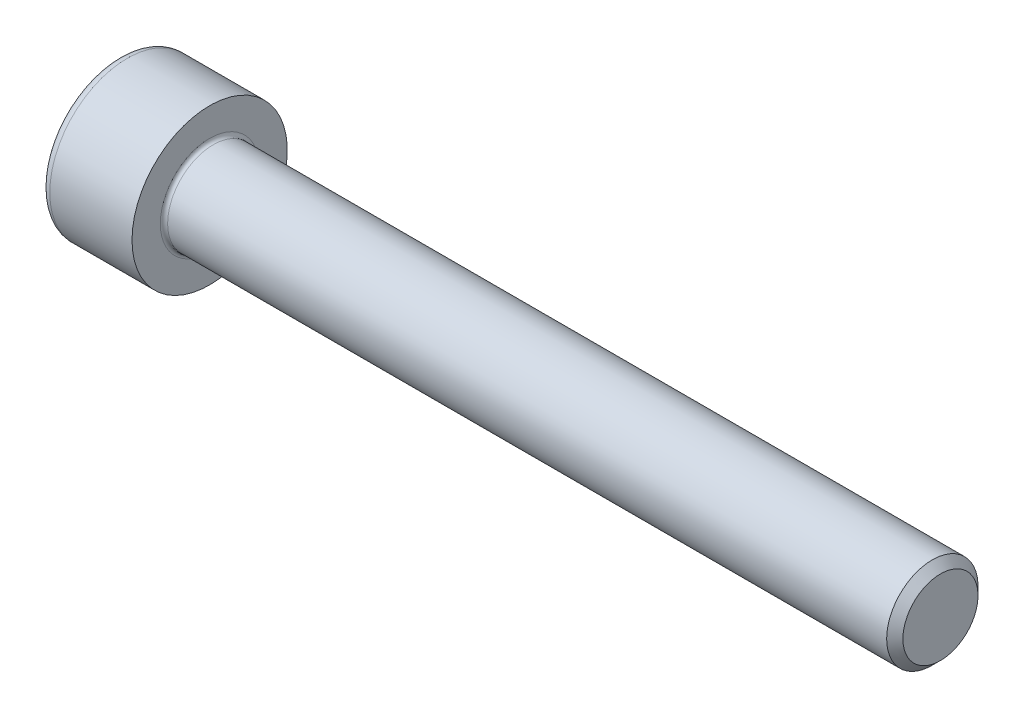
ISO-10303-21;
HEADER;
FILE_DESCRIPTION(('STEP AP214'),'2;1');
FILE_NAME('part.step','',(''),(''),'','','');
FILE_SCHEMA(('AUTOMOTIVE_DESIGN { 1 0 10303 214 1 1 1 1 }'));
ENDSEC;
DATA;
#1=APPLICATION_CONTEXT('core data for automotive mechanical design processes');
#2=APPLICATION_PROTOCOL_DEFINITION('international standard','automotive_design',2000,#1);
#3=PRODUCT_CONTEXT('',#1,'mechanical');
#4=PRODUCT('Part','Part','',(#3));
#5=PRODUCT_RELATED_PRODUCT_CATEGORY('part','',(#4));
#6=PRODUCT_DEFINITION_FORMATION('','',#4);
#7=PRODUCT_DEFINITION_CONTEXT('part definition',#1,'design');
#8=PRODUCT_DEFINITION('design','',#6,#7);
#9=PRODUCT_DEFINITION_SHAPE('','',#8);
#10=(LENGTH_UNIT() NAMED_UNIT(*) SI_UNIT(.MILLI.,.METRE.));
#11=(NAMED_UNIT(*) PLANE_ANGLE_UNIT() SI_UNIT($,.RADIAN.));
#12=(NAMED_UNIT(*) SI_UNIT($,.STERADIAN.) SOLID_ANGLE_UNIT());
#13=UNCERTAINTY_MEASURE_WITH_UNIT(LENGTH_MEASURE(1.E-05),#10,'distance_accuracy_value','');
#14=(GEOMETRIC_REPRESENTATION_CONTEXT(3) GLOBAL_UNCERTAINTY_ASSIGNED_CONTEXT((#13)) GLOBAL_UNIT_ASSIGNED_CONTEXT((#10,
#11,#12)) REPRESENTATION_CONTEXT('',''));
#15=CARTESIAN_POINT('',(0.,0.,0.));
#16=DIRECTION('',(0.,0.,1.));
#17=DIRECTION('',(1.,0.,0.));
#18=AXIS2_PLACEMENT_3D('',#15,#16,#17);
#19=CARTESIAN_POINT('',(2.5,3.48142212321344,-2.00999999999996));
#20=DIRECTION('',(1.,0.,0.));
#21=DIRECTION('',(0.,0.,-1.));
#22=AXIS2_PLACEMENT_3D('',#19,#20,#21);
#23=PLANE('',#22);
#24=DIRECTION('',(0.,1.,0.));
#25=VECTOR('',#24,1.);
#26=CARTESIAN_POINT('',(2.5,3.48142212321344,2.00999999999996));
#27=LINE('',#26,#25);
#28=CARTESIAN_POINT('',(2.50000000001364,0.,2.00999999998183));
#29=VERTEX_POINT('',#28);
#30=CARTESIAN_POINT('',(2.5,-1.16047404107116,2.00999999999996));
#31=VERTEX_POINT('',#30);
#32=EDGE_CURVE('E103',#29,#31,#27,.F.);
#33=ORIENTED_EDGE('',*,*,#32,.F.);
#34=CARTESIAN_POINT('',(2.50000000002175,0.,0.));
#35=DIRECTION('',(-1.,0.,0.));
#36=DIRECTION('',(0.,0.,1.));
#37=AXIS2_PLACEMENT_3D('',#34,#35,#36);
#38=CIRCLE('',#37,2.0099999999843);
#39=CARTESIAN_POINT('',(2.50000000001087,-1.74071106159992,1.0049999999961));
#40=VERTEX_POINT('',#39);
#41=EDGE_CURVE('E105',#29,#40,#38,.F.);
#42=ORIENTED_EDGE('',*,*,#41,.T.);
#43=DIRECTION('',(0.,-0.500000000000027,-0.866025403784423));
#44=VECTOR('',#43,1.);
#45=CARTESIAN_POINT('',(2.5,-1.16047404107116,2.00999999999996));
#46=LINE('',#45,#44);
#47=EDGE_CURVE('E108',#31,#40,#46,.T.);
#48=ORIENTED_EDGE('',*,*,#47,.F.);
#49=EDGE_LOOP('',(#33,#42,#48));
#50=FACE_BOUND('',#49,.T.);
#51=ADVANCED_FACE('F18',(#50),#23,.F.);
#52=CARTESIAN_POINT('',(2.5,3.48142212321344,-2.00999999999996));
#53=DIRECTION('',(1.,0.,0.));
#54=DIRECTION('',(0.,0.,-1.));
#55=AXIS2_PLACEMENT_3D('',#52,#53,#54);
#56=PLANE('',#55);
#57=DIRECTION('',(0.,-0.499999999999985,-0.866025403784447));
#58=VECTOR('',#57,1.);
#59=CARTESIAN_POINT('',(2.5,-1.74071106160673,1.00500000000003));
#60=LINE('',#59,#58);
#61=CARTESIAN_POINT('',(2.5,-2.3209480821423,0.));
#62=VERTEX_POINT('',#61);
#63=EDGE_CURVE('E177',#40,#62,#60,.T.);
#64=ORIENTED_EDGE('',*,*,#63,.F.);
#65=CARTESIAN_POINT('',(2.50000000002175,0.,0.));
#66=DIRECTION('',(-1.,0.,0.));
#67=DIRECTION('',(0.,0.,1.));
#68=AXIS2_PLACEMENT_3D('',#65,#66,#67);
#69=CIRCLE('',#68,2.0099999999843);
#70=CARTESIAN_POINT('',(2.50000000001087,-1.74071106159992,-1.0049999999961));
#71=VERTEX_POINT('',#70);
#72=EDGE_CURVE('E123',#40,#71,#69,.F.);
#73=ORIENTED_EDGE('',*,*,#72,.T.);
#74=DIRECTION('',(0.,0.499999999999985,-0.866025403784447));
#75=VECTOR('',#74,1.);
#76=CARTESIAN_POINT('',(2.5,-2.3209480821423,0.));
#77=LINE('',#76,#75);
#78=EDGE_CURVE('E173',#62,#71,#77,.T.);
#79=ORIENTED_EDGE('',*,*,#78,.F.);
#80=EDGE_LOOP('',(#64,#73,#79));
#81=FACE_BOUND('',#80,.T.);
#82=ADVANCED_FACE('F367',(#81),#56,.F.);
#83=CARTESIAN_POINT('',(2.5,3.48142212321344,-2.00999999999996));
#84=DIRECTION('',(1.,0.,0.));
#85=DIRECTION('',(0.,0.,-1.));
#86=AXIS2_PLACEMENT_3D('',#83,#84,#85);
#87=PLANE('',#86);
#88=DIRECTION('',(0.,0.500000000000027,-0.866025403784423));
#89=VECTOR('',#88,1.);
#90=CARTESIAN_POINT('',(2.5,-1.74071106160673,-1.00500000000003));
#91=LINE('',#90,#89);
#92=CARTESIAN_POINT('',(2.5,-1.16047404107116,-2.00999999999996));
#93=VERTEX_POINT('',#92);
#94=EDGE_CURVE('E169',#71,#93,#91,.T.);
#95=ORIENTED_EDGE('',*,*,#94,.F.);
#96=CARTESIAN_POINT('',(2.50000000002175,0.,0.));
#97=DIRECTION('',(-1.,0.,0.));
#98=DIRECTION('',(0.,0.,1.));
#99=AXIS2_PLACEMENT_3D('',#96,#97,#98);
#100=CIRCLE('',#99,2.0099999999843);
#101=CARTESIAN_POINT('',(2.50000000001364,0.,-2.00999999998183));
#102=VERTEX_POINT('',#101);
#103=EDGE_CURVE('E223',#71,#102,#100,.F.);
#104=ORIENTED_EDGE('',*,*,#103,.T.);
#105=DIRECTION('',(0.,1.,0.));
#106=VECTOR('',#105,1.);
#107=CARTESIAN_POINT('',(2.5,3.48142212321344,-2.00999999999996));
#108=LINE('',#107,#106);
#109=EDGE_CURVE('E165',#93,#102,#108,.T.);
#110=ORIENTED_EDGE('',*,*,#109,.F.);
#111=EDGE_LOOP('',(#95,#104,#110));
#112=FACE_BOUND('',#111,.T.);
#113=ADVANCED_FACE('F361',(#112),#87,.F.);
#114=CARTESIAN_POINT('',(2.5,3.48142212321344,-2.00999999999996));
#115=DIRECTION('',(1.,0.,0.));
#116=DIRECTION('',(0.,0.,-1.));
#117=AXIS2_PLACEMENT_3D('',#114,#115,#116);
#118=PLANE('',#117);
#119=DIRECTION('',(0.,1.,0.));
#120=VECTOR('',#119,1.);
#121=CARTESIAN_POINT('',(2.5,3.48142212321344,-2.00999999999996));
#122=LINE('',#121,#120);
#123=CARTESIAN_POINT('',(2.5,1.16047404107114,-2.00999999999996));
#124=VERTEX_POINT('',#123);
#125=EDGE_CURVE('E161',#102,#124,#122,.T.);
#126=ORIENTED_EDGE('',*,*,#125,.F.);
#127=CARTESIAN_POINT('',(2.50000000002175,0.,0.));
#128=DIRECTION('',(-1.,0.,0.));
#129=DIRECTION('',(0.,0.,1.));
#130=AXIS2_PLACEMENT_3D('',#127,#128,#129);
#131=CIRCLE('',#130,2.0099999999843);
#132=CARTESIAN_POINT('',(2.50000000001087,1.74071106159991,-1.00499999999611));
#133=VERTEX_POINT('',#132);
#134=EDGE_CURVE('E220',#102,#133,#131,.F.);
#135=ORIENTED_EDGE('',*,*,#134,.T.);
#136=DIRECTION('',(0.,0.500000000000027,0.866025403784423));
#137=VECTOR('',#136,1.);
#138=CARTESIAN_POINT('',(2.5,1.16047404107114,-2.00999999999996));
#139=LINE('',#138,#137);
#140=EDGE_CURVE('E157',#124,#133,#139,.T.);
#141=ORIENTED_EDGE('',*,*,#140,.F.);
#142=EDGE_LOOP('',(#126,#135,#141));
#143=FACE_BOUND('',#142,.T.);
#144=ADVANCED_FACE('F353',(#143),#118,.F.);
#145=CARTESIAN_POINT('',(2.5,3.48142212321344,-2.00999999999996));
#146=DIRECTION('',(1.,0.,0.));
#147=DIRECTION('',(0.,0.,-1.));
#148=AXIS2_PLACEMENT_3D('',#145,#146,#147);
#149=PLANE('',#148);
#150=DIRECTION('',(0.,0.499999999999985,0.866025403784447));
#151=VECTOR('',#150,1.);
#152=CARTESIAN_POINT('',(2.5,1.74071106160671,-1.00500000000003));
#153=LINE('',#152,#151);
#154=CARTESIAN_POINT('',(2.5,2.32094808214228,0.));
#155=VERTEX_POINT('',#154);
#156=EDGE_CURVE('E153',#133,#155,#153,.T.);
#157=ORIENTED_EDGE('',*,*,#156,.F.);
#158=CARTESIAN_POINT('',(2.50000000002175,0.,0.));
#159=DIRECTION('',(-1.,0.,0.));
#160=DIRECTION('',(0.,0.,1.));
#161=AXIS2_PLACEMENT_3D('',#158,#159,#160);
#162=CIRCLE('',#161,2.0099999999843);
#163=CARTESIAN_POINT('',(2.50000000001087,1.74071106159991,1.00499999999611));
#164=VERTEX_POINT('',#163);
#165=EDGE_CURVE('E131',#133,#164,#162,.F.);
#166=ORIENTED_EDGE('',*,*,#165,.T.);
#167=DIRECTION('',(0.,-0.499999999999985,0.866025403784447));
#168=VECTOR('',#167,1.);
#169=CARTESIAN_POINT('',(2.5,2.32094808214228,0.));
#170=LINE('',#169,#168);
#171=EDGE_CURVE('E124',#155,#164,#170,.T.);
#172=ORIENTED_EDGE('',*,*,#171,.F.);
#173=EDGE_LOOP('',(#157,#166,#172));
#174=FACE_BOUND('',#173,.T.);
#175=ADVANCED_FACE('F349',(#174),#149,.F.);
#176=CARTESIAN_POINT('',(2.50000000005457,0.,0.));
#177=DIRECTION('',(-1.,0.,0.));
#178=DIRECTION('',(0.,0.,1.));
#179=AXIS2_PLACEMENT_3D('',#176,#177,#178);
#180=CONICAL_SURFACE('',#179,2.00999999992746,1.04719755117379);
#181=CARTESIAN_POINT('',(3.66047404111214,0.,-5.6843418860808E-11));
#182=VERTEX_POINT('',#181);
#183=VERTEX_LOOP('',#182);
#184=FACE_BOUND('',#183,.T.);
#185=ORIENTED_EDGE('',*,*,#41,.F.);
#186=CARTESIAN_POINT('',(2.50000000002175,0.,0.));
#187=DIRECTION('',(-1.,0.,0.));
#188=DIRECTION('',(0.,0.,1.));
#189=AXIS2_PLACEMENT_3D('',#186,#187,#188);
#190=CIRCLE('',#189,2.0099999999843);
#191=EDGE_CURVE('E119',#29,#164,#190,.T.);
#192=ORIENTED_EDGE('',*,*,#191,.T.);
#193=ORIENTED_EDGE('',*,*,#165,.F.);
#194=ORIENTED_EDGE('',*,*,#134,.F.);
#195=ORIENTED_EDGE('',*,*,#103,.F.);
#196=ORIENTED_EDGE('',*,*,#72,.F.);
#197=EDGE_LOOP('',(#185,#192,#193,#194,#195,#196));
#198=FACE_BOUND('',#197,.T.);
#199=ADVANCED_FACE('F117',(#184,#198),#180,.F.);
#200=CARTESIAN_POINT('',(2.5,3.48142212321344,-2.00999999999996));
#201=DIRECTION('',(1.,0.,0.));
#202=DIRECTION('',(0.,0.,-1.));
#203=AXIS2_PLACEMENT_3D('',#200,#201,#202);
#204=PLANE('',#203);
#205=DIRECTION('',(0.,0.499999999999999,-0.866025403784439));
#206=VECTOR('',#205,1.);
#207=CARTESIAN_POINT('',(2.5,2.32094808214228,0.));
#208=LINE('',#207,#206);
#209=CARTESIAN_POINT('',(2.5,1.16047404107115,2.00999999999996));
#210=VERTEX_POINT('',#209);
#211=EDGE_CURVE('E130',#164,#210,#208,.F.);
#212=ORIENTED_EDGE('',*,*,#211,.F.);
#213=ORIENTED_EDGE('',*,*,#191,.F.);
#214=DIRECTION('',(0.,-1.,0.));
#215=VECTOR('',#214,1.);
#216=CARTESIAN_POINT('',(2.5,-1.16047404107116,2.00999999999996));
#217=LINE('',#216,#215);
#218=EDGE_CURVE('E128',#29,#210,#217,.F.);
#219=ORIENTED_EDGE('',*,*,#218,.T.);
#220=EDGE_LOOP('',(#212,#213,#219));
#221=FACE_BOUND('',#220,.T.);
#222=ADVANCED_FACE('F127',(#221),#204,.F.);
#223=CARTESIAN_POINT('',(2.5,2.32094808214228,0.));
#224=DIRECTION('',(0.,-0.866025403784439,-0.499999999999999));
#225=DIRECTION('',(0.,0.499999999999999,-0.866025403784439));
#226=AXIS2_PLACEMENT_3D('',#223,#224,#225);
#227=PLANE('',#226);
#228=ORIENTED_EDGE('',*,*,#211,.T.);
#229=DIRECTION('',(1.,0.,0.));
#230=VECTOR('',#229,1.);
#231=CARTESIAN_POINT('',(2.5,1.16047404107114,2.00999999999995));
#232=LINE('',#231,#230);
#233=CARTESIAN_POINT('',(0.,1.16047404107115,2.00999999999996));
#234=VERTEX_POINT('',#233);
#235=EDGE_CURVE('E136',#210,#234,#232,.F.);
#236=ORIENTED_EDGE('',*,*,#235,.T.);
#237=DIRECTION('',(0.,-0.500000000000006,0.866025403784435));
#238=VECTOR('',#237,1.);
#239=CARTESIAN_POINT('',(0.,2.32094808214228,0.));
#240=LINE('',#239,#238);
#241=CARTESIAN_POINT('',(0.,2.32094808214228,0.));
#242=VERTEX_POINT('',#241);
#243=EDGE_CURVE('E196',#242,#234,#240,.T.);
#244=ORIENTED_EDGE('',*,*,#243,.F.);
#245=DIRECTION('',(1.,0.,0.));
#246=VECTOR('',#245,1.);
#247=CARTESIAN_POINT('',(2.5,2.32094808214228,0.));
#248=LINE('',#247,#246);
#249=EDGE_CURVE('E188',#242,#155,#248,.T.);
#250=ORIENTED_EDGE('',*,*,#249,.T.);
#251=ORIENTED_EDGE('',*,*,#171,.T.);
#252=EDGE_LOOP('',(#228,#236,#244,#250,#251));
#253=FACE_BOUND('',#252,.T.);
#254=ADVANCED_FACE('F342',(#253),#227,.T.);
#255=CARTESIAN_POINT('',(2.5,-1.16047404107116,2.00999999999996));
#256=DIRECTION('',(0.,0.,1.));
#257=DIRECTION('',(0.,-1.,0.));
#258=AXIS2_PLACEMENT_3D('',#255,#256,#257);
#259=PLANE('',#258);
#260=ORIENTED_EDGE('',*,*,#235,.F.);
#261=ORIENTED_EDGE('',*,*,#218,.F.);
#262=ORIENTED_EDGE('',*,*,#32,.T.);
#263=DIRECTION('',(1.,0.,0.));
#264=VECTOR('',#263,1.);
#265=CARTESIAN_POINT('',(2.5,-1.16047404107116,2.00999999999996));
#266=LINE('',#265,#264);
#267=CARTESIAN_POINT('',(0.,-1.16047404107116,2.00999999999996));
#268=VERTEX_POINT('',#267);
#269=EDGE_CURVE('E138',#268,#31,#266,.T.);
#270=ORIENTED_EDGE('',*,*,#269,.F.);
#271=DIRECTION('',(0.,1.,0.));
#272=VECTOR('',#271,1.);
#273=CARTESIAN_POINT('',(0.,0.,2.00999999999996));
#274=LINE('',#273,#272);
#275=EDGE_CURVE('E337',#234,#268,#274,.F.);
#276=ORIENTED_EDGE('',*,*,#275,.F.);
#277=EDGE_LOOP('',(#260,#261,#262,#270,#276));
#278=FACE_BOUND('',#277,.T.);
#279=ADVANCED_FACE('F134',(#278),#259,.F.);
#280=CARTESIAN_POINT('',(2.5,-1.16047404107116,2.00999999999996));
#281=DIRECTION('',(0.,0.866025403784438,-0.500000000000001));
#282=DIRECTION('',(0.,0.500000000000001,0.866025403784438));
#283=AXIS2_PLACEMENT_3D('',#280,#281,#282);
#284=PLANE('',#283);
#285=ORIENTED_EDGE('',*,*,#63,.T.);
#286=DIRECTION('',(1.,0.,0.));
#287=VECTOR('',#286,1.);
#288=CARTESIAN_POINT('',(2.5,-2.3209480821423,0.));
#289=LINE('',#288,#287);
#290=CARTESIAN_POINT('',(0.,-2.32094808214229,0.));
#291=VERTEX_POINT('',#290);
#292=EDGE_CURVE('E200',#291,#62,#289,.T.);
#293=ORIENTED_EDGE('',*,*,#292,.F.);
#294=DIRECTION('',(0.,-0.500000000000006,-0.866025403784435));
#295=VECTOR('',#294,1.);
#296=CARTESIAN_POINT('',(0.,-1.16047404107116,2.00999999999996));
#297=LINE('',#296,#295);
#298=EDGE_CURVE('E334',#268,#291,#297,.T.);
#299=ORIENTED_EDGE('',*,*,#298,.F.);
#300=ORIENTED_EDGE('',*,*,#269,.T.);
#301=ORIENTED_EDGE('',*,*,#47,.T.);
#302=EDGE_LOOP('',(#285,#293,#299,#300,#301));
#303=FACE_BOUND('',#302,.T.);
#304=ADVANCED_FACE('F369',(#303),#284,.T.);
#305=CARTESIAN_POINT('',(2.5,-2.3209480821423,0.));
#306=DIRECTION('',(0.,0.866025403784439,0.499999999999999));
#307=DIRECTION('',(0.,-0.499999999999999,0.866025403784439));
#308=AXIS2_PLACEMENT_3D('',#305,#306,#307);
#309=PLANE('',#308);
#310=ORIENTED_EDGE('',*,*,#94,.T.);
#311=DIRECTION('',(1.,0.,0.));
#312=VECTOR('',#311,1.);
#313=CARTESIAN_POINT('',(2.5,-1.16047404107116,-2.00999999999995));
#314=LINE('',#313,#312);
#315=CARTESIAN_POINT('',(0.,-1.16047404107116,-2.00999999999996));
#316=VERTEX_POINT('',#315);
#317=EDGE_CURVE('E192',#93,#316,#314,.F.);
#318=ORIENTED_EDGE('',*,*,#317,.T.);
#319=DIRECTION('',(0.,0.500000000000006,-0.866025403784435));
#320=VECTOR('',#319,1.);
#321=CARTESIAN_POINT('',(0.,-2.3209480821423,0.));
#322=LINE('',#321,#320);
#323=EDGE_CURVE('E329',#291,#316,#322,.T.);
#324=ORIENTED_EDGE('',*,*,#323,.F.);
#325=ORIENTED_EDGE('',*,*,#292,.T.);
#326=ORIENTED_EDGE('',*,*,#78,.T.);
#327=EDGE_LOOP('',(#310,#318,#324,#325,#326));
#328=FACE_BOUND('',#327,.T.);
#329=ADVANCED_FACE('F363',(#328),#309,.T.);
#330=CARTESIAN_POINT('',(2.5,1.16047404107114,-2.00999999999996));
#331=DIRECTION('',(0.,0.,-1.));
#332=DIRECTION('',(0.,1.,0.));
#333=AXIS2_PLACEMENT_3D('',#330,#331,#332);
#334=PLANE('',#333);
#335=ORIENTED_EDGE('',*,*,#317,.F.);
#336=ORIENTED_EDGE('',*,*,#109,.T.);
#337=ORIENTED_EDGE('',*,*,#125,.T.);
#338=DIRECTION('',(1.,0.,0.));
#339=VECTOR('',#338,1.);
#340=CARTESIAN_POINT('',(2.5,1.16047404107115,-2.00999999999996));
#341=LINE('',#340,#339);
#342=CARTESIAN_POINT('',(0.,1.16047404107114,-2.00999999999996));
#343=VERTEX_POINT('',#342);
#344=EDGE_CURVE('E191',#124,#343,#341,.F.);
#345=ORIENTED_EDGE('',*,*,#344,.T.);
#346=DIRECTION('',(0.,1.,0.));
#347=VECTOR('',#346,1.);
#348=CARTESIAN_POINT('',(0.,0.,-2.00999999999996));
#349=LINE('',#348,#347);
#350=EDGE_CURVE('E325',#316,#343,#349,.T.);
#351=ORIENTED_EDGE('',*,*,#350,.F.);
#352=EDGE_LOOP('',(#335,#336,#337,#345,#351));
#353=FACE_BOUND('',#352,.T.);
#354=ADVANCED_FACE('F356',(#353),#334,.F.);
#355=CARTESIAN_POINT('',(2.5,2.32094808214228,0.));
#356=DIRECTION('',(0.,0.866025403784438,-0.500000000000001));
#357=DIRECTION('',(0.,0.500000000000001,0.866025403784438));
#358=AXIS2_PLACEMENT_3D('',#355,#356,#357);
#359=PLANE('',#358);
#360=ORIENTED_EDGE('',*,*,#344,.F.);
#361=ORIENTED_EDGE('',*,*,#140,.T.);
#362=ORIENTED_EDGE('',*,*,#156,.T.);
#363=ORIENTED_EDGE('',*,*,#249,.F.);
#364=DIRECTION('',(0.,0.500000000000006,0.866025403784435));
#365=VECTOR('',#364,1.);
#366=CARTESIAN_POINT('',(0.,1.16047404107114,-2.00999999999996));
#367=LINE('',#366,#365);
#368=EDGE_CURVE('E323',#343,#242,#367,.T.);
#369=ORIENTED_EDGE('',*,*,#368,.F.);
#370=EDGE_LOOP('',(#360,#361,#362,#363,#369));
#371=FACE_BOUND('',#370,.T.);
#372=ADVANCED_FACE('F299',(#371),#359,.F.);
#373=CARTESIAN_POINT('',(0.,0.,0.));
#374=DIRECTION('',(-1.,0.,0.));
#375=DIRECTION('',(0.,0.,1.));
#376=AXIS2_PLACEMENT_3D('',#373,#374,#375);
#377=PLANE('',#376);
#378=CARTESIAN_POINT('',(0.,0.,0.));
#379=DIRECTION('',(1.,0.,0.));
#380=DIRECTION('',(0.,0.,-1.));
#381=AXIS2_PLACEMENT_3D('',#378,#379,#380);
#382=CIRCLE('',#381,3.75);
#383=CARTESIAN_POINT('',(0.,0.,-3.75));
#384=VERTEX_POINT('',#383);
#385=CARTESIAN_POINT('',(0.,0.,3.75));
#386=VERTEX_POINT('',#385);
#387=EDGE_CURVE('E320',#384,#386,#382,.T.);
#388=ORIENTED_EDGE('',*,*,#387,.F.);
#389=CARTESIAN_POINT('',(0.,0.,0.));
#390=DIRECTION('',(1.,0.,0.));
#391=DIRECTION('',(0.,0.,1.));
#392=AXIS2_PLACEMENT_3D('',#389,#390,#391);
#393=CIRCLE('',#392,3.75);
#394=EDGE_CURVE('E318',#386,#384,#393,.T.);
#395=ORIENTED_EDGE('',*,*,#394,.F.);
#396=EDGE_LOOP('',(#388,#395));
#397=FACE_BOUND('',#396,.T.);
#398=ORIENTED_EDGE('',*,*,#350,.T.);
#399=ORIENTED_EDGE('',*,*,#368,.T.);
#400=ORIENTED_EDGE('',*,*,#243,.T.);
#401=ORIENTED_EDGE('',*,*,#275,.T.);
#402=ORIENTED_EDGE('',*,*,#298,.T.);
#403=ORIENTED_EDGE('',*,*,#323,.T.);
#404=EDGE_LOOP('',(#398,#399,#400,#401,#402,#403));
#405=FACE_BOUND('',#404,.T.);
#406=ADVANCED_FACE('F293',(#397,#405),#377,.T.);
#407=CARTESIAN_POINT('',(0.5,0.,0.));
#408=DIRECTION('',(-1.,0.,0.));
#409=DIRECTION('',(0.,0.,1.));
#410=AXIS2_PLACEMENT_3D('',#407,#408,#409);
#411=TOROIDAL_SURFACE('',#410,3.75,0.5);
#412=CARTESIAN_POINT('',(0.5,0.,0.));
#413=DIRECTION('',(-1.,0.,0.));
#414=DIRECTION('',(0.,0.,1.));
#415=AXIS2_PLACEMENT_3D('',#412,#413,#414);
#416=CIRCLE('',#415,4.25);
#417=CARTESIAN_POINT('',(0.5,0.,4.25));
#418=VERTEX_POINT('',#417);
#419=EDGE_CURVE('E216',#418,#418,#416,.F.);
#420=ORIENTED_EDGE('',*,*,#419,.F.);
#421=EDGE_LOOP('',(#420));
#422=FACE_BOUND('',#421,.T.);
#423=ORIENTED_EDGE('',*,*,#394,.T.);
#424=ORIENTED_EDGE('',*,*,#387,.T.);
#425=EDGE_LOOP('',(#423,#424));
#426=FACE_BOUND('',#425,.T.);
#427=ADVANCED_FACE('F288',(#422,#426),#411,.T.);
#428=CARTESIAN_POINT('',(-31.75,0.,0.));
#429=DIRECTION('',(-1.,0.,0.));
#430=DIRECTION('',(0.,0.,1.));
#431=AXIS2_PLACEMENT_3D('',#428,#429,#430);
#432=CYLINDRICAL_SURFACE('',#431,4.25);
#433=CARTESIAN_POINT('',(5.,0.,0.));
#434=DIRECTION('',(-1.,0.,0.));
#435=DIRECTION('',(0.,0.,1.));
#436=AXIS2_PLACEMENT_3D('',#433,#434,#435);
#437=CIRCLE('',#436,4.25);
#438=CARTESIAN_POINT('',(5.,0.,4.25));
#439=VERTEX_POINT('',#438);
#440=EDGE_CURVE('E214',#439,#439,#437,.F.);
#441=ORIENTED_EDGE('',*,*,#440,.F.);
#442=EDGE_LOOP('',(#441));
#443=FACE_BOUND('',#442,.T.);
#444=ORIENTED_EDGE('',*,*,#419,.T.);
#445=EDGE_LOOP('',(#444));
#446=FACE_BOUND('',#445,.T.);
#447=ADVANCED_FACE('F292',(#443,#446),#432,.T.);
#448=CARTESIAN_POINT('',(45.,2.055,0.));
#449=DIRECTION('',(1.,0.,0.));
#450=DIRECTION('',(0.,0.,-1.));
#451=AXIS2_PLACEMENT_3D('',#448,#449,#450);
#452=PLANE('',#451);
#453=CARTESIAN_POINT('',(45.0000000000159,0.,0.));
#454=DIRECTION('',(-1.,0.,0.));
#455=DIRECTION('',(0.,0.,1.));
#456=AXIS2_PLACEMENT_3D('',#453,#454,#455);
#457=CIRCLE('',#456,2.05500000004122);
#458=CARTESIAN_POINT('',(45.0000000000159,0.,2.05500000004122));
#459=VERTEX_POINT('',#458);
#460=EDGE_CURVE('E210',#459,#459,#457,.T.);
#461=ORIENTED_EDGE('',*,*,#460,.F.);
#462=EDGE_LOOP('',(#461));
#463=FACE_BOUND('',#462,.T.);
#464=ADVANCED_FACE('F265',(#463),#452,.T.);
#465=CARTESIAN_POINT('',(5.,4.25,0.));
#466=DIRECTION('',(1.,0.,0.));
#467=DIRECTION('',(0.,0.,-1.));
#468=AXIS2_PLACEMENT_3D('',#465,#466,#467);
#469=PLANE('',#468);
#470=ORIENTED_EDGE('',*,*,#440,.T.);
#471=EDGE_LOOP('',(#470));
#472=FACE_BOUND('',#471,.T.);
#473=CARTESIAN_POINT('',(5.,0.,0.));
#474=DIRECTION('',(1.,0.,0.));
#475=DIRECTION('',(0.,0.,1.));
#476=AXIS2_PLACEMENT_3D('',#473,#474,#475);
#477=CIRCLE('',#476,2.7);
#478=CARTESIAN_POINT('',(5.,0.,-2.7));
#479=VERTEX_POINT('',#478);
#480=CARTESIAN_POINT('',(5.,0.,2.7));
#481=VERTEX_POINT('',#480);
#482=EDGE_CURVE('E213',#479,#481,#477,.F.);
#483=ORIENTED_EDGE('',*,*,#482,.T.);
#484=CARTESIAN_POINT('',(5.,0.,0.));
#485=DIRECTION('',(1.,0.,0.));
#486=DIRECTION('',(0.,0.,-1.));
#487=AXIS2_PLACEMENT_3D('',#484,#485,#486);
#488=CIRCLE('',#487,2.7);
#489=EDGE_CURVE('E37',#481,#479,#488,.F.);
#490=ORIENTED_EDGE('',*,*,#489,.T.);
#491=EDGE_LOOP('',(#483,#490));
#492=FACE_BOUND('',#491,.T.);
#493=ADVANCED_FACE('F256',(#472,#492),#469,.T.);
#494=CARTESIAN_POINT('',(44.5550000001731,0.,0.));
#495=DIRECTION('',(-1.,0.,0.));
#496=DIRECTION('',(0.,0.,1.));
#497=AXIS2_PLACEMENT_3D('',#494,#495,#496);
#498=CONICAL_SURFACE('',#497,2.49999999988404,0.785398163397448);
#499=CARTESIAN_POINT('',(44.555,0.,0.));
#500=DIRECTION('',(-1.,0.,0.));
#501=DIRECTION('',(0.,0.,1.));
#502=AXIS2_PLACEMENT_3D('',#499,#500,#501);
#503=CIRCLE('',#502,2.5);
#504=CARTESIAN_POINT('',(44.555,0.,2.5));
#505=VERTEX_POINT('',#504);
#506=EDGE_CURVE('E29',#505,#505,#503,.T.);
#507=ORIENTED_EDGE('',*,*,#506,.F.);
#508=EDGE_LOOP('',(#507));
#509=FACE_BOUND('',#508,.T.);
#510=ORIENTED_EDGE('',*,*,#460,.T.);
#511=EDGE_LOOP('',(#510));
#512=FACE_BOUND('',#511,.T.);
#513=ADVANCED_FACE('F244',(#509,#512),#498,.T.);
#514=CARTESIAN_POINT('',(5.2,0.,0.));
#515=DIRECTION('',(1.,0.,0.));
#516=DIRECTION('',(0.,0.,-1.));
#517=AXIS2_PLACEMENT_3D('',#514,#515,#516);
#518=TOROIDAL_SURFACE('',#517,2.7,0.2);
#519=CARTESIAN_POINT('',(5.2,0.,0.));
#520=DIRECTION('',(-1.,0.,0.));
#521=DIRECTION('',(0.,0.,1.));
#522=AXIS2_PLACEMENT_3D('',#519,#520,#521);
#523=CIRCLE('',#522,2.5);
#524=CARTESIAN_POINT('',(5.2,0.,2.5));
#525=VERTEX_POINT('',#524);
#526=EDGE_CURVE('E11',#525,#525,#523,.F.);
#527=ORIENTED_EDGE('',*,*,#526,.F.);
#528=EDGE_LOOP('',(#527));
#529=FACE_BOUND('',#528,.T.);
#530=ORIENTED_EDGE('',*,*,#482,.F.);
#531=ORIENTED_EDGE('',*,*,#489,.F.);
#532=EDGE_LOOP('',(#530,#531));
#533=FACE_BOUND('',#532,.T.);
#534=ADVANCED_FACE('F232',(#529,#533),#518,.F.);
#535=CARTESIAN_POINT('',(-31.75,0.,0.));
#536=DIRECTION('',(-1.,0.,0.));
#537=DIRECTION('',(0.,0.,1.));
#538=AXIS2_PLACEMENT_3D('',#535,#536,#537);
#539=CYLINDRICAL_SURFACE('',#538,2.5);
#540=ORIENTED_EDGE('',*,*,#526,.T.);
#541=EDGE_LOOP('',(#540));
#542=FACE_BOUND('',#541,.T.);
#543=ORIENTED_EDGE('',*,*,#506,.T.);
#544=EDGE_LOOP('',(#543));
#545=FACE_BOUND('',#544,.T.);
#546=ADVANCED_FACE('F243',(#542,#545),#539,.T.);
#547=CLOSED_SHELL('',(#51,#82,#113,#144,#175,#199,#222,#254,#279,#304,#329,#354,#372,#406,#427,
#447,#464,#493,#513,#534,#546));
#548=MANIFOLD_SOLID_BREP('B1',#547);
#549=ADVANCED_BREP_SHAPE_REPRESENTATION('',(#18,#548),#14);
#550=SHAPE_DEFINITION_REPRESENTATION(#9,#549);
ENDSEC;
END-ISO-10303-21;
